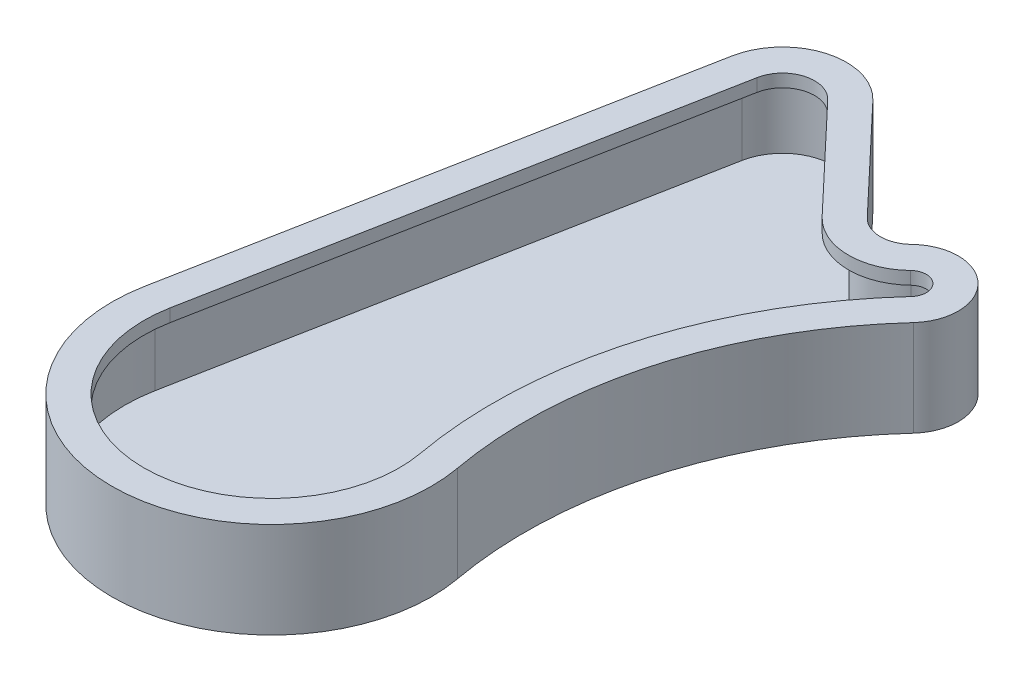
ISO-10303-21;
HEADER;
FILE_DESCRIPTION(('STEP AP214'),'2;1');
FILE_NAME('part.step','',(''),(''),'','','');
FILE_SCHEMA(('AUTOMOTIVE_DESIGN { 1 0 10303 214 1 1 1 1 }'));
ENDSEC;
DATA;
#1=APPLICATION_CONTEXT('core data for automotive mechanical design processes');
#2=APPLICATION_PROTOCOL_DEFINITION('international standard','automotive_design',2000,#1);
#3=PRODUCT_CONTEXT('',#1,'mechanical');
#4=PRODUCT('Part','Part','',(#3));
#5=PRODUCT_RELATED_PRODUCT_CATEGORY('part','',(#4));
#6=PRODUCT_DEFINITION_FORMATION('','',#4);
#7=PRODUCT_DEFINITION_CONTEXT('part definition',#1,'design');
#8=PRODUCT_DEFINITION('design','',#6,#7);
#9=PRODUCT_DEFINITION_SHAPE('','',#8);
#10=(LENGTH_UNIT() NAMED_UNIT(*) SI_UNIT(.MILLI.,.METRE.));
#11=(NAMED_UNIT(*) PLANE_ANGLE_UNIT() SI_UNIT($,.RADIAN.));
#12=(NAMED_UNIT(*) SI_UNIT($,.STERADIAN.) SOLID_ANGLE_UNIT());
#13=UNCERTAINTY_MEASURE_WITH_UNIT(LENGTH_MEASURE(1.E-05),#10,'distance_accuracy_value','');
#14=(GEOMETRIC_REPRESENTATION_CONTEXT(3) GLOBAL_UNCERTAINTY_ASSIGNED_CONTEXT((#13)) GLOBAL_UNIT_ASSIGNED_CONTEXT((#10,
#11,#12)) REPRESENTATION_CONTEXT('',''));
#15=CARTESIAN_POINT('',(0.,0.,0.));
#16=DIRECTION('',(0.,0.,1.));
#17=DIRECTION('',(1.,0.,0.));
#18=AXIS2_PLACEMENT_3D('',#15,#16,#17);
#19=CARTESIAN_POINT('',(0.,15.,0.));
#20=DIRECTION('',(0.,1.,0.));
#21=DIRECTION('',(0.,0.,1.));
#22=AXIS2_PLACEMENT_3D('',#19,#20,#21);
#23=PLANE('',#22);
#24=CARTESIAN_POINT('',(0.,15.,0.));
#25=DIRECTION('',(0.,1.,0.));
#26=DIRECTION('',(0.,0.,1.));
#27=AXIS2_PLACEMENT_3D('',#24,#25,#26);
#28=CIRCLE('',#27,25.);
#29=CARTESIAN_POINT('',(-24.5566150710964,15.,-4.6875));
#30=VERTEX_POINT('',#29);
#31=CARTESIAN_POINT('',(24.595709121542,15.,-4.47784466104999));
#32=VERTEX_POINT('',#31);
#33=EDGE_CURVE('E344',#30,#32,#28,.T.);
#34=ORIENTED_EDGE('',*,*,#33,.T.);
#35=CARTESIAN_POINT('',(88.5445528375513,15.,-16.1202407797801));
#36=DIRECTION('',(0.,-1.,0.));
#37=DIRECTION('',(0.,0.,-1.));
#38=AXIS2_PLACEMENT_3D('',#35,#36,#37);
#39=CIRCLE('',#38,65.);
#40=CARTESIAN_POINT('',(40.5390916728501,15.,-59.9434731841152));
#41=VERTEX_POINT('',#40);
#42=EDGE_CURVE('E348',#32,#41,#39,.T.);
#43=ORIENTED_EDGE('',*,*,#42,.T.);
#44=CARTESIAN_POINT('',(35.,15.,-65.));
#45=DIRECTION('',(0.,1.,0.));
#46=DIRECTION('',(0.,0.,1.));
#47=AXIS2_PLACEMENT_3D('',#44,#45,#46);
#48=CIRCLE('',#47,7.50000000000001);
#49=CARTESIAN_POINT('',(29.7951945281307,15.,-70.4));
#50=VERTEX_POINT('',#49);
#51=EDGE_CURVE('E352',#41,#50,#48,.T.);
#52=ORIENTED_EDGE('',*,*,#51,.T.);
#53=CARTESIAN_POINT('',(26.3253242135512,15.,-74.));
#54=DIRECTION('',(0.,-1.,0.));
#55=DIRECTION('',(0.,0.,1.));
#56=AXIS2_PLACEMENT_3D('',#53,#54,#55);
#57=CIRCLE('',#56,5.);
#58=CARTESIAN_POINT('',(22.6931837774403,15.,-70.5637875717051));
#59=VERTEX_POINT('',#58);
#60=EDGE_CURVE('E355',#50,#59,#57,.T.);
#61=ORIENTED_EDGE('',*,*,#60,.T.);
#62=DIRECTION('',(-0.687242485658971,0.,-0.726428087222183));
#63=VECTOR('',#62,1.);
#64=CARTESIAN_POINT('',(7.26428087222184,15.,-86.8724248565897));
#65=LINE('',#64,#63);
#66=CARTESIAN_POINT('',(7.26428087222184,15.,-86.8724248565897));
#67=VERTEX_POINT('',#66);
#68=EDGE_CURVE('E358',#59,#67,#65,.T.);
#69=ORIENTED_EDGE('',*,*,#68,.T.);
#70=CARTESIAN_POINT('',(0.,15.,-80.));
#71=DIRECTION('',(0.,1.,0.));
#72=DIRECTION('',(0.,0.,1.));
#73=AXIS2_PLACEMENT_3D('',#70,#71,#72);
#74=CIRCLE('',#73,10.);
#75=CARTESIAN_POINT('',(-9.82264602843858,15.,-81.875));
#76=VERTEX_POINT('',#75);
#77=EDGE_CURVE('E361',#67,#76,#74,.T.);
#78=ORIENTED_EDGE('',*,*,#77,.T.);
#79=DIRECTION('',(-0.1875,0.,0.982264602843857));
#80=VECTOR('',#79,1.);
#81=CARTESIAN_POINT('',(-24.5566150710964,15.,-4.6875));
#82=LINE('',#81,#80);
#83=EDGE_CURVE('E364',#76,#30,#82,.T.);
#84=ORIENTED_EDGE('',*,*,#83,.T.);
#85=EDGE_LOOP('',(#34,#43,#52,#61,#69,#78,#84));
#86=FACE_BOUND('',#85,.T.);
#87=CARTESIAN_POINT('',(0.,15.,-80.));
#88=DIRECTION('',(0.,1.,0.));
#89=DIRECTION('',(0.,0.,1.));
#90=AXIS2_PLACEMENT_3D('',#87,#88,#89);
#91=CIRCLE('',#90,5.00000000000001);
#92=CARTESIAN_POINT('',(3.63214043611092,15.,-83.4362124282949));
#93=VERTEX_POINT('',#92);
#94=CARTESIAN_POINT('',(-4.91132301421929,15.,-80.9375));
#95=VERTEX_POINT('',#94);
#96=EDGE_CURVE('E191',#93,#95,#91,.T.);
#97=ORIENTED_EDGE('',*,*,#96,.F.);
#98=DIRECTION('',(-0.687242485658971,0.,-0.726428087222183));
#99=VECTOR('',#98,1.);
#100=CARTESIAN_POINT('',(19.0610433413294,15.,-67.1275751434103));
#101=LINE('',#100,#99);
#102=CARTESIAN_POINT('',(19.0610433413294,15.,-67.1275751434103));
#103=VERTEX_POINT('',#102);
#104=EDGE_CURVE('E212',#103,#93,#101,.T.);
#105=ORIENTED_EDGE('',*,*,#104,.F.);
#106=CARTESIAN_POINT('',(26.3253242135512,15.,-74.));
#107=DIRECTION('',(0.,-1.,0.));
#108=DIRECTION('',(0.,0.,1.));
#109=AXIS2_PLACEMENT_3D('',#106,#107,#108);
#110=CIRCLE('',#109,10.);
#111=CARTESIAN_POINT('',(33.2650648427102,15.,-66.8));
#112=VERTEX_POINT('',#111);
#113=EDGE_CURVE('E216',#112,#103,#110,.T.);
#114=ORIENTED_EDGE('',*,*,#113,.F.);
#115=CARTESIAN_POINT('',(35.,15.,-65.));
#116=DIRECTION('',(0.,1.,0.));
#117=DIRECTION('',(0.,0.,1.));
#118=AXIS2_PLACEMENT_3D('',#115,#116,#117);
#119=CIRCLE('',#118,2.5);
#120=CARTESIAN_POINT('',(36.8463638909501,15.,-63.3144910613717));
#121=VERTEX_POINT('',#120);
#122=EDGE_CURVE('E247',#121,#112,#119,.T.);
#123=ORIENTED_EDGE('',*,*,#122,.F.);
#124=CARTESIAN_POINT('',(88.5445528375513,15.,-16.1202407797801));
#125=DIRECTION('',(0.,-1.,0.));
#126=DIRECTION('',(0.,0.,1.));
#127=AXIS2_PLACEMENT_3D('',#124,#125,#126);
#128=CIRCLE('',#127,70.);
#129=CARTESIAN_POINT('',(19.6765672972336,15.,-3.58227572883998));
#130=VERTEX_POINT('',#129);
#131=EDGE_CURVE('E243',#130,#121,#128,.T.);
#132=ORIENTED_EDGE('',*,*,#131,.F.);
#133=CARTESIAN_POINT('',(0.,15.,0.));
#134=DIRECTION('',(0.,1.,0.));
#135=DIRECTION('',(0.,0.,1.));
#136=AXIS2_PLACEMENT_3D('',#133,#134,#135);
#137=CIRCLE('',#136,20.);
#138=CARTESIAN_POINT('',(-19.6452920568771,15.,-3.74999999999997));
#139=VERTEX_POINT('',#138);
#140=EDGE_CURVE('E239',#139,#130,#137,.T.);
#141=ORIENTED_EDGE('',*,*,#140,.F.);
#142=DIRECTION('',(-0.1875,0.,0.982264602843857));
#143=VECTOR('',#142,1.);
#144=CARTESIAN_POINT('',(-4.91132301421929,15.,-80.9375));
#145=LINE('',#144,#143);
#146=EDGE_CURVE('E236',#95,#139,#145,.T.);
#147=ORIENTED_EDGE('',*,*,#146,.F.);
#148=EDGE_LOOP('',(#97,#105,#114,#123,#132,#141,#147));
#149=FACE_BOUND('',#148,.T.);
#150=ADVANCED_FACE('F39',(#86,#149),#23,.T.);
#151=CARTESIAN_POINT('',(0.,15.,0.));
#152=DIRECTION('',(0.,-1.,0.));
#153=DIRECTION('',(0.,0.,-1.));
#154=AXIS2_PLACEMENT_3D('',#151,#152,#153);
#155=CYLINDRICAL_SURFACE('',#154,25.);
#156=DIRECTION('',(0.,-1.,0.));
#157=VECTOR('',#156,1.);
#158=CARTESIAN_POINT('',(-24.5566150710964,15.,-4.6875));
#159=LINE('',#158,#157);
#160=CARTESIAN_POINT('',(-24.5566150710964,0.,-4.6875));
#161=VERTEX_POINT('',#160);
#162=EDGE_CURVE('E367',#30,#161,#159,.T.);
#163=ORIENTED_EDGE('',*,*,#162,.T.);
#164=CARTESIAN_POINT('',(0.,0.,0.));
#165=DIRECTION('',(0.,1.,0.));
#166=DIRECTION('',(0.,0.,1.));
#167=AXIS2_PLACEMENT_3D('',#164,#165,#166);
#168=CIRCLE('',#167,25.);
#169=CARTESIAN_POINT('',(24.595709121542,0.,-4.47784466104999));
#170=VERTEX_POINT('',#169);
#171=EDGE_CURVE('E323',#161,#170,#168,.T.);
#172=ORIENTED_EDGE('',*,*,#171,.T.);
#173=DIRECTION('',(0.,-1.,0.));
#174=VECTOR('',#173,1.);
#175=CARTESIAN_POINT('',(24.595709121542,15.,-4.47784466104999));
#176=LINE('',#175,#174);
#177=EDGE_CURVE('E48',#32,#170,#176,.T.);
#178=ORIENTED_EDGE('',*,*,#177,.F.);
#179=ORIENTED_EDGE('',*,*,#33,.F.);
#180=EDGE_LOOP('',(#163,#172,#178,#179));
#181=FACE_BOUND('',#180,.T.);
#182=ADVANCED_FACE('F41',(#181),#155,.T.);
#183=CARTESIAN_POINT('',(88.5445528375513,15.,-16.1202407797801));
#184=DIRECTION('',(0.,-1.,0.));
#185=DIRECTION('',(0.,0.,-1.));
#186=AXIS2_PLACEMENT_3D('',#183,#184,#185);
#187=CYLINDRICAL_SURFACE('',#186,65.);
#188=ORIENTED_EDGE('',*,*,#177,.T.);
#189=CARTESIAN_POINT('',(88.5445528375513,0.,-16.1202407797801));
#190=DIRECTION('',(0.,-1.,0.));
#191=DIRECTION('',(0.,0.,-1.));
#192=AXIS2_PLACEMENT_3D('',#189,#190,#191);
#193=CIRCLE('',#192,65.);
#194=CARTESIAN_POINT('',(40.5390916728501,0.,-59.9434731841152));
#195=VERTEX_POINT('',#194);
#196=EDGE_CURVE('E371',#170,#195,#193,.T.);
#197=ORIENTED_EDGE('',*,*,#196,.T.);
#198=DIRECTION('',(0.,-1.,0.));
#199=VECTOR('',#198,1.);
#200=CARTESIAN_POINT('',(40.5390916728501,15.,-59.9434731841152));
#201=LINE('',#200,#199);
#202=EDGE_CURVE('E408',#41,#195,#201,.T.);
#203=ORIENTED_EDGE('',*,*,#202,.F.);
#204=ORIENTED_EDGE('',*,*,#42,.F.);
#205=EDGE_LOOP('',(#188,#197,#203,#204));
#206=FACE_BOUND('',#205,.T.);
#207=ADVANCED_FACE('F414',(#206),#187,.F.);
#208=CARTESIAN_POINT('',(35.,15.,-65.));
#209=DIRECTION('',(0.,-1.,0.));
#210=DIRECTION('',(0.,0.,-1.));
#211=AXIS2_PLACEMENT_3D('',#208,#209,#210);
#212=CYLINDRICAL_SURFACE('',#211,7.50000000000001);
#213=ORIENTED_EDGE('',*,*,#202,.T.);
#214=CARTESIAN_POINT('',(35.,0.,-65.));
#215=DIRECTION('',(0.,1.,0.));
#216=DIRECTION('',(0.,0.,1.));
#217=AXIS2_PLACEMENT_3D('',#214,#215,#216);
#218=CIRCLE('',#217,7.50000000000001);
#219=CARTESIAN_POINT('',(29.7951945281307,0.,-70.4));
#220=VERTEX_POINT('',#219);
#221=EDGE_CURVE('E375',#195,#220,#218,.T.);
#222=ORIENTED_EDGE('',*,*,#221,.T.);
#223=DIRECTION('',(0.,-1.,0.));
#224=VECTOR('',#223,1.);
#225=CARTESIAN_POINT('',(29.7951945281307,15.,-70.4));
#226=LINE('',#225,#224);
#227=EDGE_CURVE('E405',#50,#220,#226,.T.);
#228=ORIENTED_EDGE('',*,*,#227,.F.);
#229=ORIENTED_EDGE('',*,*,#51,.F.);
#230=EDGE_LOOP('',(#213,#222,#228,#229));
#231=FACE_BOUND('',#230,.T.);
#232=ADVANCED_FACE('F445',(#231),#212,.T.);
#233=CARTESIAN_POINT('',(26.3253242135512,15.,-74.));
#234=DIRECTION('',(0.,-1.,0.));
#235=DIRECTION('',(0.,0.,-1.));
#236=AXIS2_PLACEMENT_3D('',#233,#234,#235);
#237=CYLINDRICAL_SURFACE('',#236,5.);
#238=ORIENTED_EDGE('',*,*,#227,.T.);
#239=CARTESIAN_POINT('',(26.3253242135512,0.,-74.));
#240=DIRECTION('',(0.,-1.,0.));
#241=DIRECTION('',(0.,0.,1.));
#242=AXIS2_PLACEMENT_3D('',#239,#240,#241);
#243=CIRCLE('',#242,5.);
#244=CARTESIAN_POINT('',(22.6931837774403,0.,-70.5637875717051));
#245=VERTEX_POINT('',#244);
#246=EDGE_CURVE('E379',#220,#245,#243,.T.);
#247=ORIENTED_EDGE('',*,*,#246,.T.);
#248=DIRECTION('',(0.,-1.,0.));
#249=VECTOR('',#248,1.);
#250=CARTESIAN_POINT('',(22.6931837774403,15.,-70.5637875717051));
#251=LINE('',#250,#249);
#252=EDGE_CURVE('E402',#59,#245,#251,.T.);
#253=ORIENTED_EDGE('',*,*,#252,.F.);
#254=ORIENTED_EDGE('',*,*,#60,.F.);
#255=EDGE_LOOP('',(#238,#247,#253,#254));
#256=FACE_BOUND('',#255,.T.);
#257=ADVANCED_FACE('F441',(#256),#237,.F.);
#258=CARTESIAN_POINT('',(7.26428087222184,15.,-86.8724248565897));
#259=DIRECTION('',(-0.726428087222183,0.,0.687242485658971));
#260=DIRECTION('',(0.687242485658971,0.,0.726428087222183));
#261=AXIS2_PLACEMENT_3D('',#258,#259,#260);
#262=PLANE('',#261);
#263=ORIENTED_EDGE('',*,*,#252,.T.);
#264=DIRECTION('',(-0.687242485658971,0.,-0.726428087222183));
#265=VECTOR('',#264,1.);
#266=CARTESIAN_POINT('',(7.26428087222184,0.,-86.8724248565897));
#267=LINE('',#266,#265);
#268=CARTESIAN_POINT('',(7.26428087222184,0.,-86.8724248565897));
#269=VERTEX_POINT('',#268);
#270=EDGE_CURVE('E383',#245,#269,#267,.T.);
#271=ORIENTED_EDGE('',*,*,#270,.T.);
#272=DIRECTION('',(0.,-1.,0.));
#273=VECTOR('',#272,1.);
#274=CARTESIAN_POINT('',(7.26428087222184,15.,-86.8724248565897));
#275=LINE('',#274,#273);
#276=EDGE_CURVE('E399',#67,#269,#275,.T.);
#277=ORIENTED_EDGE('',*,*,#276,.F.);
#278=ORIENTED_EDGE('',*,*,#68,.F.);
#279=EDGE_LOOP('',(#263,#271,#277,#278));
#280=FACE_BOUND('',#279,.T.);
#281=ADVANCED_FACE('F437',(#280),#262,.F.);
#282=CARTESIAN_POINT('',(0.,15.,-80.));
#283=DIRECTION('',(0.,-1.,0.));
#284=DIRECTION('',(0.,0.,-1.));
#285=AXIS2_PLACEMENT_3D('',#282,#283,#284);
#286=CYLINDRICAL_SURFACE('',#285,10.);
#287=ORIENTED_EDGE('',*,*,#276,.T.);
#288=CARTESIAN_POINT('',(0.,0.,-80.));
#289=DIRECTION('',(0.,1.,0.));
#290=DIRECTION('',(0.,0.,1.));
#291=AXIS2_PLACEMENT_3D('',#288,#289,#290);
#292=CIRCLE('',#291,10.);
#293=CARTESIAN_POINT('',(-9.82264602843858,0.,-81.875));
#294=VERTEX_POINT('',#293);
#295=EDGE_CURVE('E387',#269,#294,#292,.T.);
#296=ORIENTED_EDGE('',*,*,#295,.T.);
#297=DIRECTION('',(0.,-1.,0.));
#298=VECTOR('',#297,1.);
#299=CARTESIAN_POINT('',(-9.82264602843858,15.,-81.875));
#300=LINE('',#299,#298);
#301=EDGE_CURVE('E396',#76,#294,#300,.T.);
#302=ORIENTED_EDGE('',*,*,#301,.F.);
#303=ORIENTED_EDGE('',*,*,#77,.F.);
#304=EDGE_LOOP('',(#287,#296,#302,#303));
#305=FACE_BOUND('',#304,.T.);
#306=ADVANCED_FACE('F432',(#305),#286,.T.);
#307=CARTESIAN_POINT('',(-24.5566150710964,15.,-4.6875));
#308=DIRECTION('',(0.982264602843857,0.,0.1875));
#309=DIRECTION('',(0.1875,0.,-0.982264602843857));
#310=AXIS2_PLACEMENT_3D('',#307,#308,#309);
#311=PLANE('',#310);
#312=ORIENTED_EDGE('',*,*,#301,.T.);
#313=DIRECTION('',(-0.1875,0.,0.982264602843857));
#314=VECTOR('',#313,1.);
#315=CARTESIAN_POINT('',(-24.5566150710964,0.,-4.6875));
#316=LINE('',#315,#314);
#317=EDGE_CURVE('E349',#294,#161,#316,.T.);
#318=ORIENTED_EDGE('',*,*,#317,.T.);
#319=ORIENTED_EDGE('',*,*,#162,.F.);
#320=ORIENTED_EDGE('',*,*,#83,.F.);
#321=EDGE_LOOP('',(#312,#318,#319,#320));
#322=FACE_BOUND('',#321,.T.);
#323=ADVANCED_FACE('F427',(#322),#311,.F.);
#324=CARTESIAN_POINT('',(0.,0.,0.));
#325=DIRECTION('',(0.,1.,0.));
#326=DIRECTION('',(0.,0.,1.));
#327=AXIS2_PLACEMENT_3D('',#324,#325,#326);
#328=PLANE('',#327);
#329=ORIENTED_EDGE('',*,*,#171,.F.);
#330=ORIENTED_EDGE('',*,*,#317,.F.);
#331=ORIENTED_EDGE('',*,*,#295,.F.);
#332=ORIENTED_EDGE('',*,*,#270,.F.);
#333=ORIENTED_EDGE('',*,*,#246,.F.);
#334=ORIENTED_EDGE('',*,*,#221,.F.);
#335=ORIENTED_EDGE('',*,*,#196,.F.);
#336=EDGE_LOOP('',(#329,#330,#331,#332,#333,#334,#335));
#337=FACE_BOUND('',#336,.T.);
#338=ADVANCED_FACE('F421',(#337),#328,.F.);
#339=CARTESIAN_POINT('',(0.,13.0000000000001,0.));
#340=DIRECTION('',(0.,1.,0.));
#341=DIRECTION('',(0.,0.,1.));
#342=AXIS2_PLACEMENT_3D('',#339,#340,#341);
#343=PLANE('',#342);
#344=CARTESIAN_POINT('',(88.5445528375513,13.0000000000001,-16.1202407797801));
#345=DIRECTION('',(0.,1.,0.));
#346=DIRECTION('',(0.,0.,1.));
#347=AXIS2_PLACEMENT_3D('',#344,#345,#346);
#348=CIRCLE('',#347,67.);
#349=CARTESIAN_POINT('',(39.0620005600901,13.0000000000001,-61.2918803350178));
#350=VERTEX_POINT('',#349);
#351=CARTESIAN_POINT('',(22.6280523918187,13.0000000000001,-4.11961708816601));
#352=VERTEX_POINT('',#351);
#353=EDGE_CURVE('E11',#350,#352,#348,.T.);
#354=ORIENTED_EDGE('',*,*,#353,.T.);
#355=CARTESIAN_POINT('',(0.,13.0000000000001,0.));
#356=DIRECTION('',(0.,1.,0.));
#357=DIRECTION('',(0.,0.,1.));
#358=AXIS2_PLACEMENT_3D('',#355,#356,#357);
#359=CIRCLE('',#358,23.);
#360=CARTESIAN_POINT('',(-22.5920858654087,13.0000000000001,-4.3125));
#361=VERTEX_POINT('',#360);
#362=EDGE_CURVE('E287',#352,#361,#359,.F.);
#363=ORIENTED_EDGE('',*,*,#362,.T.);
#364=DIRECTION('',(0.1875,0.,-0.982264602843857));
#365=VECTOR('',#364,1.);
#366=CARTESIAN_POINT('',(-7.85811682275086,13.0000000000001,-81.5));
#367=LINE('',#366,#365);
#368=CARTESIAN_POINT('',(-7.85811682275086,13.0000000000001,-81.5));
#369=VERTEX_POINT('',#368);
#370=EDGE_CURVE('E55',#361,#369,#367,.T.);
#371=ORIENTED_EDGE('',*,*,#370,.T.);
#372=CARTESIAN_POINT('',(0.,13.0000000000001,-80.));
#373=DIRECTION('',(0.,1.,0.));
#374=DIRECTION('',(0.,0.,1.));
#375=AXIS2_PLACEMENT_3D('',#372,#373,#374);
#376=CIRCLE('',#375,8.00000000000001);
#377=CARTESIAN_POINT('',(5.81142469777747,13.0000000000001,-85.4979398852718));
#378=VERTEX_POINT('',#377);
#379=EDGE_CURVE('E63',#369,#378,#376,.F.);
#380=ORIENTED_EDGE('',*,*,#379,.T.);
#381=DIRECTION('',(0.68724248565897,0.,0.726428087222183));
#382=VECTOR('',#381,1.);
#383=CARTESIAN_POINT('',(21.240327602996,13.0000000000001,-69.1893026003872));
#384=LINE('',#383,#382);
#385=CARTESIAN_POINT('',(21.240327602996,13.0000000000001,-69.1893026003872));
#386=VERTEX_POINT('',#385);
#387=EDGE_CURVE('E279',#378,#386,#384,.T.);
#388=ORIENTED_EDGE('',*,*,#387,.T.);
#389=CARTESIAN_POINT('',(26.3253242135512,13.0000000000001,-74.));
#390=DIRECTION('',(0.,1.,0.));
#391=DIRECTION('',(0.,0.,1.));
#392=AXIS2_PLACEMENT_3D('',#389,#390,#391);
#393=CIRCLE('',#392,7.);
#394=CARTESIAN_POINT('',(31.1831426539625,13.0000000000001,-68.96));
#395=VERTEX_POINT('',#394);
#396=EDGE_CURVE('E275',#386,#395,#393,.T.);
#397=ORIENTED_EDGE('',*,*,#396,.T.);
#398=CARTESIAN_POINT('',(35.,13.0000000000001,-65.));
#399=DIRECTION('',(0.,1.,0.));
#400=DIRECTION('',(0.,0.,1.));
#401=AXIS2_PLACEMENT_3D('',#398,#399,#400);
#402=CIRCLE('',#401,5.5);
#403=EDGE_CURVE('E257',#395,#350,#402,.F.);
#404=ORIENTED_EDGE('',*,*,#403,.T.);
#405=EDGE_LOOP('',(#354,#363,#371,#380,#388,#397,#404));
#406=FACE_BOUND('',#405,.T.);
#407=DIRECTION('',(-0.687242485658971,0.,-0.726428087222183));
#408=VECTOR('',#407,1.);
#409=CARTESIAN_POINT('',(19.0610433413294,13.0000000000001,-67.1275751434103));
#410=LINE('',#409,#408);
#411=CARTESIAN_POINT('',(19.0610433413294,13.0000000000001,-67.1275751434103));
#412=VERTEX_POINT('',#411);
#413=CARTESIAN_POINT('',(3.63214043611092,13.0000000000001,-83.4362124282949));
#414=VERTEX_POINT('',#413);
#415=EDGE_CURVE('E197',#412,#414,#410,.T.);
#416=ORIENTED_EDGE('',*,*,#415,.T.);
#417=CARTESIAN_POINT('',(0.,13.0000000000001,-80.));
#418=DIRECTION('',(0.,1.,0.));
#419=DIRECTION('',(0.,0.,1.));
#420=AXIS2_PLACEMENT_3D('',#417,#418,#419);
#421=CIRCLE('',#420,5.00000000000001);
#422=CARTESIAN_POINT('',(-4.91132301421929,13.0000000000001,-80.9375));
#423=VERTEX_POINT('',#422);
#424=EDGE_CURVE('E188',#414,#423,#421,.T.);
#425=ORIENTED_EDGE('',*,*,#424,.T.);
#426=DIRECTION('',(-0.1875,0.,0.982264602843857));
#427=VECTOR('',#426,1.);
#428=CARTESIAN_POINT('',(-4.91132301421929,13.0000000000001,-80.9375));
#429=LINE('',#428,#427);
#430=CARTESIAN_POINT('',(-19.6452920568772,13.0000000000001,-3.74999999999997));
#431=VERTEX_POINT('',#430);
#432=EDGE_CURVE('E201',#423,#431,#429,.T.);
#433=ORIENTED_EDGE('',*,*,#432,.T.);
#434=CARTESIAN_POINT('',(0.,13.0000000000001,0.));
#435=DIRECTION('',(0.,1.,0.));
#436=DIRECTION('',(0.,0.,1.));
#437=AXIS2_PLACEMENT_3D('',#434,#435,#436);
#438=CIRCLE('',#437,20.);
#439=CARTESIAN_POINT('',(19.6765672972336,13.0000000000001,-3.58227572883998));
#440=VERTEX_POINT('',#439);
#441=EDGE_CURVE('E206',#431,#440,#438,.T.);
#442=ORIENTED_EDGE('',*,*,#441,.T.);
#443=CARTESIAN_POINT('',(88.5445528375513,13.0000000000001,-16.1202407797801));
#444=DIRECTION('',(0.,-1.,0.));
#445=DIRECTION('',(0.,0.,1.));
#446=AXIS2_PLACEMENT_3D('',#443,#444,#445);
#447=CIRCLE('',#446,70.);
#448=CARTESIAN_POINT('',(36.8463638909501,13.0000000000001,-63.3144910613717));
#449=VERTEX_POINT('',#448);
#450=EDGE_CURVE('E221',#440,#449,#447,.T.);
#451=ORIENTED_EDGE('',*,*,#450,.T.);
#452=CARTESIAN_POINT('',(35.,13.0000000000001,-65.));
#453=DIRECTION('',(0.,1.,0.));
#454=DIRECTION('',(0.,0.,1.));
#455=AXIS2_PLACEMENT_3D('',#452,#453,#454);
#456=CIRCLE('',#455,2.5);
#457=CARTESIAN_POINT('',(33.2650648427102,13.0000000000001,-66.8));
#458=VERTEX_POINT('',#457);
#459=EDGE_CURVE('E225',#449,#458,#456,.T.);
#460=ORIENTED_EDGE('',*,*,#459,.T.);
#461=CARTESIAN_POINT('',(26.3253242135512,13.0000000000001,-74.));
#462=DIRECTION('',(0.,-1.,0.));
#463=DIRECTION('',(0.,0.,1.));
#464=AXIS2_PLACEMENT_3D('',#461,#462,#463);
#465=CIRCLE('',#464,10.);
#466=EDGE_CURVE('E229',#458,#412,#465,.T.);
#467=ORIENTED_EDGE('',*,*,#466,.T.);
#468=EDGE_LOOP('',(#416,#425,#433,#442,#451,#460,#467));
#469=FACE_BOUND('',#468,.T.);
#470=ADVANCED_FACE('F208',(#406,#469),#343,.F.);
#471=CARTESIAN_POINT('',(0.,13.0000000000001,-80.));
#472=DIRECTION('',(0.,1.,0.));
#473=DIRECTION('',(0.,0.,1.));
#474=AXIS2_PLACEMENT_3D('',#471,#472,#473);
#475=CYLINDRICAL_SURFACE('',#474,5.00000000000001);
#476=ORIENTED_EDGE('',*,*,#96,.T.);
#477=DIRECTION('',(0.,1.,0.));
#478=VECTOR('',#477,1.);
#479=CARTESIAN_POINT('',(-4.91132301421929,13.0000000000001,-80.9375));
#480=LINE('',#479,#478);
#481=EDGE_CURVE('E184',#423,#95,#480,.T.);
#482=ORIENTED_EDGE('',*,*,#481,.F.);
#483=ORIENTED_EDGE('',*,*,#424,.F.);
#484=DIRECTION('',(0.,1.,0.));
#485=VECTOR('',#484,1.);
#486=CARTESIAN_POINT('',(3.63214043611092,13.0000000000001,-83.4362124282949));
#487=LINE('',#486,#485);
#488=EDGE_CURVE('E254',#414,#93,#487,.T.);
#489=ORIENTED_EDGE('',*,*,#488,.T.);
#490=EDGE_LOOP('',(#476,#482,#483,#489));
#491=FACE_BOUND('',#490,.T.);
#492=ADVANCED_FACE('F186',(#491),#475,.F.);
#493=CARTESIAN_POINT('',(19.0610433413294,13.0000000000001,-67.1275751434103));
#494=DIRECTION('',(0.726428087222183,0.,-0.687242485658971));
#495=DIRECTION('',(-0.687242485658971,0.,-0.726428087222183));
#496=AXIS2_PLACEMENT_3D('',#493,#494,#495);
#497=PLANE('',#496);
#498=ORIENTED_EDGE('',*,*,#104,.T.);
#499=ORIENTED_EDGE('',*,*,#488,.F.);
#500=ORIENTED_EDGE('',*,*,#415,.F.);
#501=DIRECTION('',(0.,1.,0.));
#502=VECTOR('',#501,1.);
#503=CARTESIAN_POINT('',(19.0610433413294,13.0000000000001,-67.1275751434103));
#504=LINE('',#503,#502);
#505=EDGE_CURVE('E258',#412,#103,#504,.T.);
#506=ORIENTED_EDGE('',*,*,#505,.T.);
#507=EDGE_LOOP('',(#498,#499,#500,#506));
#508=FACE_BOUND('',#507,.T.);
#509=ADVANCED_FACE('F467',(#508),#497,.F.);
#510=CARTESIAN_POINT('',(26.3253242135512,13.0000000000001,-74.));
#511=DIRECTION('',(0.,1.,0.));
#512=DIRECTION('',(0.,0.,1.));
#513=AXIS2_PLACEMENT_3D('',#510,#511,#512);
#514=CYLINDRICAL_SURFACE('',#513,10.);
#515=ORIENTED_EDGE('',*,*,#113,.T.);
#516=ORIENTED_EDGE('',*,*,#505,.F.);
#517=ORIENTED_EDGE('',*,*,#466,.F.);
#518=DIRECTION('',(0.,1.,0.));
#519=VECTOR('',#518,1.);
#520=CARTESIAN_POINT('',(33.2650648427102,13.0000000000001,-66.8));
#521=LINE('',#520,#519);
#522=EDGE_CURVE('E261',#458,#112,#521,.T.);
#523=ORIENTED_EDGE('',*,*,#522,.T.);
#524=EDGE_LOOP('',(#515,#516,#517,#523));
#525=FACE_BOUND('',#524,.T.);
#526=ADVANCED_FACE('F465',(#525),#514,.T.);
#527=CARTESIAN_POINT('',(35.,13.0000000000001,-65.));
#528=DIRECTION('',(0.,1.,0.));
#529=DIRECTION('',(0.,0.,1.));
#530=AXIS2_PLACEMENT_3D('',#527,#528,#529);
#531=CYLINDRICAL_SURFACE('',#530,2.5);
#532=ORIENTED_EDGE('',*,*,#122,.T.);
#533=ORIENTED_EDGE('',*,*,#522,.F.);
#534=ORIENTED_EDGE('',*,*,#459,.F.);
#535=DIRECTION('',(0.,1.,0.));
#536=VECTOR('',#535,1.);
#537=CARTESIAN_POINT('',(36.8463638909501,13.0000000000001,-63.3144910613717));
#538=LINE('',#537,#536);
#539=EDGE_CURVE('E264',#449,#121,#538,.T.);
#540=ORIENTED_EDGE('',*,*,#539,.T.);
#541=EDGE_LOOP('',(#532,#533,#534,#540));
#542=FACE_BOUND('',#541,.T.);
#543=ADVANCED_FACE('F462',(#542),#531,.F.);
#544=CARTESIAN_POINT('',(88.5445528375513,13.0000000000001,-16.1202407797801));
#545=DIRECTION('',(0.,1.,0.));
#546=DIRECTION('',(0.,0.,1.));
#547=AXIS2_PLACEMENT_3D('',#544,#545,#546);
#548=CYLINDRICAL_SURFACE('',#547,70.);
#549=ORIENTED_EDGE('',*,*,#131,.T.);
#550=ORIENTED_EDGE('',*,*,#539,.F.);
#551=ORIENTED_EDGE('',*,*,#450,.F.);
#552=DIRECTION('',(0.,1.,0.));
#553=VECTOR('',#552,1.);
#554=CARTESIAN_POINT('',(19.6765672972336,13.0000000000001,-3.58227572883998));
#555=LINE('',#554,#553);
#556=EDGE_CURVE('E267',#440,#130,#555,.T.);
#557=ORIENTED_EDGE('',*,*,#556,.T.);
#558=EDGE_LOOP('',(#549,#550,#551,#557));
#559=FACE_BOUND('',#558,.T.);
#560=ADVANCED_FACE('F460',(#559),#548,.T.);
#561=CARTESIAN_POINT('',(0.,13.0000000000001,0.));
#562=DIRECTION('',(0.,1.,0.));
#563=DIRECTION('',(0.,0.,1.));
#564=AXIS2_PLACEMENT_3D('',#561,#562,#563);
#565=CYLINDRICAL_SURFACE('',#564,20.);
#566=ORIENTED_EDGE('',*,*,#140,.T.);
#567=ORIENTED_EDGE('',*,*,#556,.F.);
#568=ORIENTED_EDGE('',*,*,#441,.F.);
#569=DIRECTION('',(0.,1.,0.));
#570=VECTOR('',#569,1.);
#571=CARTESIAN_POINT('',(-19.6452920568771,13.0000000000001,-3.74999999999997));
#572=LINE('',#571,#570);
#573=EDGE_CURVE('E196',#431,#139,#572,.T.);
#574=ORIENTED_EDGE('',*,*,#573,.T.);
#575=EDGE_LOOP('',(#566,#567,#568,#574));
#576=FACE_BOUND('',#575,.T.);
#577=ADVANCED_FACE('F456',(#576),#565,.F.);
#578=CARTESIAN_POINT('',(-4.91132301421929,13.0000000000001,-80.9375));
#579=DIRECTION('',(-0.982264602843857,0.,-0.1875));
#580=DIRECTION('',(-0.1875,0.,0.982264602843857));
#581=AXIS2_PLACEMENT_3D('',#578,#579,#580);
#582=PLANE('',#581);
#583=ORIENTED_EDGE('',*,*,#146,.T.);
#584=ORIENTED_EDGE('',*,*,#573,.F.);
#585=ORIENTED_EDGE('',*,*,#432,.F.);
#586=ORIENTED_EDGE('',*,*,#481,.T.);
#587=EDGE_LOOP('',(#583,#584,#585,#586));
#588=FACE_BOUND('',#587,.T.);
#589=ADVANCED_FACE('F202',(#588),#582,.F.);
#590=CARTESIAN_POINT('',(0.,2.,0.));
#591=DIRECTION('',(0.,1.,0.));
#592=DIRECTION('',(0.,0.,1.));
#593=AXIS2_PLACEMENT_3D('',#590,#591,#592);
#594=PLANE('',#593);
#595=CARTESIAN_POINT('',(0.,2.,0.));
#596=DIRECTION('',(0.,1.,0.));
#597=DIRECTION('',(0.,0.,1.));
#598=AXIS2_PLACEMENT_3D('',#595,#596,#597);
#599=CIRCLE('',#598,23.);
#600=CARTESIAN_POINT('',(-22.5920858654087,2.,-4.3125));
#601=VERTEX_POINT('',#600);
#602=CARTESIAN_POINT('',(22.6280523918187,2.,-4.11961708816601));
#603=VERTEX_POINT('',#602);
#604=EDGE_CURVE('E291',#601,#603,#599,.T.);
#605=ORIENTED_EDGE('',*,*,#604,.T.);
#606=CARTESIAN_POINT('',(88.5445528375513,2.,-16.1202407797801));
#607=DIRECTION('',(0.,-1.,0.));
#608=DIRECTION('',(0.,0.,1.));
#609=AXIS2_PLACEMENT_3D('',#606,#607,#608);
#610=CIRCLE('',#609,67.);
#611=CARTESIAN_POINT('',(39.0620005600901,2.,-61.2918803350178));
#612=VERTEX_POINT('',#611);
#613=EDGE_CURVE('E295',#603,#612,#610,.T.);
#614=ORIENTED_EDGE('',*,*,#613,.T.);
#615=CARTESIAN_POINT('',(35.,2.,-65.));
#616=DIRECTION('',(0.,1.,0.));
#617=DIRECTION('',(0.,0.,1.));
#618=AXIS2_PLACEMENT_3D('',#615,#616,#617);
#619=CIRCLE('',#618,5.5);
#620=CARTESIAN_POINT('',(31.1831426539625,2.,-68.96));
#621=VERTEX_POINT('',#620);
#622=EDGE_CURVE('E299',#612,#621,#619,.T.);
#623=ORIENTED_EDGE('',*,*,#622,.T.);
#624=CARTESIAN_POINT('',(26.3253242135512,2.,-74.));
#625=DIRECTION('',(0.,-1.,0.));
#626=DIRECTION('',(0.,0.,1.));
#627=AXIS2_PLACEMENT_3D('',#624,#625,#626);
#628=CIRCLE('',#627,7.);
#629=CARTESIAN_POINT('',(21.240327602996,2.,-69.1893026003872));
#630=VERTEX_POINT('',#629);
#631=EDGE_CURVE('E303',#621,#630,#628,.T.);
#632=ORIENTED_EDGE('',*,*,#631,.T.);
#633=DIRECTION('',(-0.68724248565897,0.,-0.726428087222183));
#634=VECTOR('',#633,1.);
#635=CARTESIAN_POINT('',(21.240327602996,2.,-69.1893026003872));
#636=LINE('',#635,#634);
#637=CARTESIAN_POINT('',(5.81142469777747,2.,-85.4979398852718));
#638=VERTEX_POINT('',#637);
#639=EDGE_CURVE('E307',#630,#638,#636,.T.);
#640=ORIENTED_EDGE('',*,*,#639,.T.);
#641=CARTESIAN_POINT('',(0.,2.,-80.));
#642=DIRECTION('',(0.,1.,0.));
#643=DIRECTION('',(0.,0.,1.));
#644=AXIS2_PLACEMENT_3D('',#641,#642,#643);
#645=CIRCLE('',#644,8.00000000000001);
#646=CARTESIAN_POINT('',(-7.85811682275086,2.,-81.5));
#647=VERTEX_POINT('',#646);
#648=EDGE_CURVE('E311',#638,#647,#645,.T.);
#649=ORIENTED_EDGE('',*,*,#648,.T.);
#650=DIRECTION('',(-0.1875,0.,0.982264602843857));
#651=VECTOR('',#650,1.);
#652=CARTESIAN_POINT('',(-7.85811682275086,2.,-81.5));
#653=LINE('',#652,#651);
#654=EDGE_CURVE('E315',#647,#601,#653,.T.);
#655=ORIENTED_EDGE('',*,*,#654,.T.);
#656=EDGE_LOOP('',(#605,#614,#623,#632,#640,#649,#655));
#657=FACE_BOUND('',#656,.T.);
#658=ADVANCED_FACE('F484',(#657),#594,.T.);
#659=CARTESIAN_POINT('',(88.5445528375513,2.,-16.1202407797801));
#660=DIRECTION('',(0.,1.,0.));
#661=DIRECTION('',(0.,0.,1.));
#662=AXIS2_PLACEMENT_3D('',#659,#660,#661);
#663=CYLINDRICAL_SURFACE('',#662,67.);
#664=ORIENTED_EDGE('',*,*,#353,.F.);
#665=DIRECTION('',(0.,1.,0.));
#666=VECTOR('',#665,1.);
#667=CARTESIAN_POINT('',(39.0620005600901,2.,-61.2918803350178));
#668=LINE('',#667,#666);
#669=EDGE_CURVE('E338',#612,#350,#668,.T.);
#670=ORIENTED_EDGE('',*,*,#669,.F.);
#671=ORIENTED_EDGE('',*,*,#613,.F.);
#672=DIRECTION('',(0.,1.,0.));
#673=VECTOR('',#672,1.);
#674=CARTESIAN_POINT('',(22.6280523918187,2.,-4.11961708816601));
#675=LINE('',#674,#673);
#676=EDGE_CURVE('E319',#603,#352,#675,.T.);
#677=ORIENTED_EDGE('',*,*,#676,.T.);
#678=EDGE_LOOP('',(#664,#670,#671,#677));
#679=FACE_BOUND('',#678,.T.);
#680=ADVANCED_FACE('F491',(#679),#663,.T.);
#681=CARTESIAN_POINT('',(35.,2.,-65.));
#682=DIRECTION('',(0.,1.,0.));
#683=DIRECTION('',(0.,0.,1.));
#684=AXIS2_PLACEMENT_3D('',#681,#682,#683);
#685=CYLINDRICAL_SURFACE('',#684,5.5);
#686=ORIENTED_EDGE('',*,*,#403,.F.);
#687=DIRECTION('',(0.,1.,0.));
#688=VECTOR('',#687,1.);
#689=CARTESIAN_POINT('',(31.1831426539625,2.,-68.96));
#690=LINE('',#689,#688);
#691=EDGE_CURVE('E334',#621,#395,#690,.T.);
#692=ORIENTED_EDGE('',*,*,#691,.F.);
#693=ORIENTED_EDGE('',*,*,#622,.F.);
#694=ORIENTED_EDGE('',*,*,#669,.T.);
#695=EDGE_LOOP('',(#686,#692,#693,#694));
#696=FACE_BOUND('',#695,.T.);
#697=ADVANCED_FACE('F507',(#696),#685,.F.);
#698=CARTESIAN_POINT('',(26.3253242135512,2.,-74.));
#699=DIRECTION('',(0.,1.,0.));
#700=DIRECTION('',(0.,0.,1.));
#701=AXIS2_PLACEMENT_3D('',#698,#699,#700);
#702=CYLINDRICAL_SURFACE('',#701,7.);
#703=ORIENTED_EDGE('',*,*,#396,.F.);
#704=DIRECTION('',(0.,1.,0.));
#705=VECTOR('',#704,1.);
#706=CARTESIAN_POINT('',(21.240327602996,2.,-69.1893026003872));
#707=LINE('',#706,#705);
#708=EDGE_CURVE('E330',#630,#386,#707,.T.);
#709=ORIENTED_EDGE('',*,*,#708,.F.);
#710=ORIENTED_EDGE('',*,*,#631,.F.);
#711=ORIENTED_EDGE('',*,*,#691,.T.);
#712=EDGE_LOOP('',(#703,#709,#710,#711));
#713=FACE_BOUND('',#712,.T.);
#714=ADVANCED_FACE('F503',(#713),#702,.T.);
#715=CARTESIAN_POINT('',(21.240327602996,2.,-69.1893026003872));
#716=DIRECTION('',(0.726428087222183,0.,-0.68724248565897));
#717=DIRECTION('',(-0.68724248565897,0.,-0.726428087222183));
#718=AXIS2_PLACEMENT_3D('',#715,#716,#717);
#719=PLANE('',#718);
#720=ORIENTED_EDGE('',*,*,#387,.F.);
#721=DIRECTION('',(0.,1.,0.));
#722=VECTOR('',#721,1.);
#723=CARTESIAN_POINT('',(5.81142469777747,2.,-85.4979398852718));
#724=LINE('',#723,#722);
#725=EDGE_CURVE('E327',#638,#378,#724,.T.);
#726=ORIENTED_EDGE('',*,*,#725,.F.);
#727=ORIENTED_EDGE('',*,*,#639,.F.);
#728=ORIENTED_EDGE('',*,*,#708,.T.);
#729=EDGE_LOOP('',(#720,#726,#727,#728));
#730=FACE_BOUND('',#729,.T.);
#731=ADVANCED_FACE('F500',(#730),#719,.F.);
#732=CARTESIAN_POINT('',(0.,2.,-80.));
#733=DIRECTION('',(0.,1.,0.));
#734=DIRECTION('',(0.,0.,1.));
#735=AXIS2_PLACEMENT_3D('',#732,#733,#734);
#736=CYLINDRICAL_SURFACE('',#735,8.00000000000001);
#737=ORIENTED_EDGE('',*,*,#379,.F.);
#738=DIRECTION('',(0.,1.,0.));
#739=VECTOR('',#738,1.);
#740=CARTESIAN_POINT('',(-7.85811682275086,2.,-81.5));
#741=LINE('',#740,#739);
#742=EDGE_CURVE('E324',#647,#369,#741,.T.);
#743=ORIENTED_EDGE('',*,*,#742,.F.);
#744=ORIENTED_EDGE('',*,*,#648,.F.);
#745=ORIENTED_EDGE('',*,*,#725,.T.);
#746=EDGE_LOOP('',(#737,#743,#744,#745));
#747=FACE_BOUND('',#746,.T.);
#748=ADVANCED_FACE('F497',(#747),#736,.F.);
#749=CARTESIAN_POINT('',(-7.85811682275086,2.,-81.5));
#750=DIRECTION('',(-0.982264602843857,0.,-0.1875));
#751=DIRECTION('',(-0.1875,0.,0.982264602843857));
#752=AXIS2_PLACEMENT_3D('',#749,#750,#751);
#753=PLANE('',#752);
#754=ORIENTED_EDGE('',*,*,#370,.F.);
#755=DIRECTION('',(0.,1.,0.));
#756=VECTOR('',#755,1.);
#757=CARTESIAN_POINT('',(-22.5920858654087,2.,-4.3125));
#758=LINE('',#757,#756);
#759=EDGE_CURVE('E320',#601,#361,#758,.T.);
#760=ORIENTED_EDGE('',*,*,#759,.F.);
#761=ORIENTED_EDGE('',*,*,#654,.F.);
#762=ORIENTED_EDGE('',*,*,#742,.T.);
#763=EDGE_LOOP('',(#754,#760,#761,#762));
#764=FACE_BOUND('',#763,.T.);
#765=ADVANCED_FACE('F493',(#764),#753,.F.);
#766=CARTESIAN_POINT('',(0.,2.,0.));
#767=DIRECTION('',(0.,1.,0.));
#768=DIRECTION('',(0.,0.,1.));
#769=AXIS2_PLACEMENT_3D('',#766,#767,#768);
#770=CYLINDRICAL_SURFACE('',#769,23.);
#771=ORIENTED_EDGE('',*,*,#362,.F.);
#772=ORIENTED_EDGE('',*,*,#676,.F.);
#773=ORIENTED_EDGE('',*,*,#604,.F.);
#774=ORIENTED_EDGE('',*,*,#759,.T.);
#775=EDGE_LOOP('',(#771,#772,#773,#774));
#776=FACE_BOUND('',#775,.T.);
#777=ADVANCED_FACE('F496',(#776),#770,.F.);
#778=CLOSED_SHELL('',(#150,#182,#207,#232,#257,#281,#306,#323,#338,#470,#492,#509,#526,#543,
#560,#577,#589,#658,#680,#697,#714,#731,#748,#765,#777));
#779=MANIFOLD_SOLID_BREP('B2',#778);
#780=ADVANCED_BREP_SHAPE_REPRESENTATION('',(#18,#779),#14);
#781=SHAPE_DEFINITION_REPRESENTATION(#9,#780);
ENDSEC;
END-ISO-10303-21;
